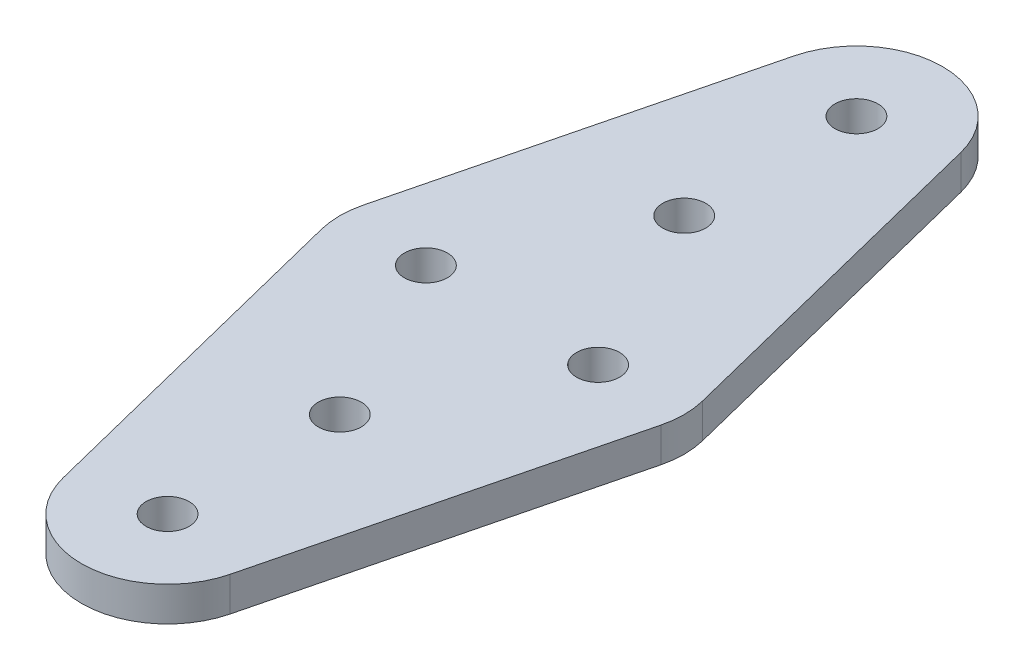
ISO-10303-21;
HEADER;
FILE_DESCRIPTION(('STEP AP214'),'2;1');
FILE_NAME('part.step','',(''),(''),'','','');
FILE_SCHEMA(('AUTOMOTIVE_DESIGN { 1 0 10303 214 1 1 1 1 }'));
ENDSEC;
DATA;
#1=APPLICATION_CONTEXT('core data for automotive mechanical design processes');
#2=APPLICATION_PROTOCOL_DEFINITION('international standard','automotive_design',2000,#1);
#3=PRODUCT_CONTEXT('',#1,'mechanical');
#4=PRODUCT('Part','Part','',(#3));
#5=PRODUCT_RELATED_PRODUCT_CATEGORY('part','',(#4));
#6=PRODUCT_DEFINITION_FORMATION('','',#4);
#7=PRODUCT_DEFINITION_CONTEXT('part definition',#1,'design');
#8=PRODUCT_DEFINITION('design','',#6,#7);
#9=PRODUCT_DEFINITION_SHAPE('','',#8);
#10=(LENGTH_UNIT() NAMED_UNIT(*) SI_UNIT(.MILLI.,.METRE.));
#11=(NAMED_UNIT(*) PLANE_ANGLE_UNIT() SI_UNIT($,.RADIAN.));
#12=(NAMED_UNIT(*) SI_UNIT($,.STERADIAN.) SOLID_ANGLE_UNIT());
#13=UNCERTAINTY_MEASURE_WITH_UNIT(LENGTH_MEASURE(1.E-05),#10,'distance_accuracy_value','');
#14=(GEOMETRIC_REPRESENTATION_CONTEXT(3) GLOBAL_UNCERTAINTY_ASSIGNED_CONTEXT((#13)) GLOBAL_UNIT_ASSIGNED_CONTEXT((#10,
#11,#12)) REPRESENTATION_CONTEXT('',''));
#15=CARTESIAN_POINT('',(0.,0.,0.));
#16=DIRECTION('',(0.,0.,1.));
#17=DIRECTION('',(1.,0.,0.));
#18=AXIS2_PLACEMENT_3D('',#15,#16,#17);
#19=CARTESIAN_POINT('',(-9.99999999999999,4.,0.));
#20=DIRECTION('',(0.,1.,0.));
#21=DIRECTION('',(0.,0.,1.));
#22=AXIS2_PLACEMENT_3D('',#19,#20,#21);
#23=PLANE('',#22);
#24=CARTESIAN_POINT('',(0.,4.,20.));
#25=DIRECTION('',(0.,1.,0.));
#26=DIRECTION('',(0.,0.,-1.));
#27=AXIS2_PLACEMENT_3D('',#24,#25,#26);
#28=CIRCLE('',#27,2.5);
#29=CARTESIAN_POINT('',(0.,4.,17.5));
#30=VERTEX_POINT('',#29);
#31=EDGE_CURVE('E204',#30,#30,#28,.T.);
#32=ORIENTED_EDGE('',*,*,#31,.F.);
#33=EDGE_LOOP('',(#32));
#34=FACE_BOUND('',#33,.T.);
#35=CARTESIAN_POINT('',(0.,4.,-20.));
#36=DIRECTION('',(0.,1.,0.));
#37=DIRECTION('',(0.,0.,1.));
#38=AXIS2_PLACEMENT_3D('',#35,#36,#37);
#39=CIRCLE('',#38,2.5);
#40=CARTESIAN_POINT('',(0.,4.,-17.5));
#41=VERTEX_POINT('',#40);
#42=EDGE_CURVE('E192',#41,#41,#39,.T.);
#43=ORIENTED_EDGE('',*,*,#42,.F.);
#44=EDGE_LOOP('',(#43));
#45=FACE_BOUND('',#44,.T.);
#46=CARTESIAN_POINT('',(10.,4.,0.));
#47=DIRECTION('',(0.,1.,0.));
#48=DIRECTION('',(0.,0.,1.));
#49=AXIS2_PLACEMENT_3D('',#46,#47,#48);
#50=CIRCLE('',#49,2.5);
#51=CARTESIAN_POINT('',(10.,4.,2.5));
#52=VERTEX_POINT('',#51);
#53=EDGE_CURVE('E138',#52,#52,#50,.T.);
#54=ORIENTED_EDGE('',*,*,#53,.F.);
#55=EDGE_LOOP('',(#54));
#56=FACE_BOUND('',#55,.T.);
#57=CARTESIAN_POINT('',(-9.99999999999999,4.,0.));
#58=DIRECTION('',(0.,1.,0.));
#59=DIRECTION('',(0.,0.,1.));
#60=AXIS2_PLACEMENT_3D('',#57,#58,#59);
#61=CIRCLE('',#60,10.);
#62=CARTESIAN_POINT('',(-19.7014250014533,4.,-2.42535625036333));
#63=VERTEX_POINT('',#62);
#64=CARTESIAN_POINT('',(-19.7014250014533,4.,2.42535625036333));
#65=VERTEX_POINT('',#64);
#66=EDGE_CURVE('E149',#63,#65,#61,.T.);
#67=ORIENTED_EDGE('',*,*,#66,.T.);
#68=DIRECTION('',(0.242535625036333,0.,0.970142500145332));
#69=VECTOR('',#68,1.);
#70=CARTESIAN_POINT('',(-9.70142500145332,4.,42.4253562503633));
#71=LINE('',#70,#69);
#72=CARTESIAN_POINT('',(-9.70142500145332,4.,42.4253562503633));
#73=VERTEX_POINT('',#72);
#74=EDGE_CURVE('E97',#65,#73,#71,.T.);
#75=ORIENTED_EDGE('',*,*,#74,.T.);
#76=CARTESIAN_POINT('',(0.,4.,40.));
#77=DIRECTION('',(0.,1.,0.));
#78=DIRECTION('',(0.,0.,-1.));
#79=AXIS2_PLACEMENT_3D('',#76,#77,#78);
#80=CIRCLE('',#79,10.);
#81=CARTESIAN_POINT('',(9.70142500145332,4.,42.4253562503633));
#82=VERTEX_POINT('',#81);
#83=EDGE_CURVE('E164',#73,#82,#80,.T.);
#84=ORIENTED_EDGE('',*,*,#83,.T.);
#85=DIRECTION('',(0.242535625036333,0.,-0.970142500145332));
#86=VECTOR('',#85,1.);
#87=CARTESIAN_POINT('',(9.70142500145332,4.,42.4253562503633));
#88=LINE('',#87,#86);
#89=CARTESIAN_POINT('',(19.7014250014533,4.,2.42535625036333));
#90=VERTEX_POINT('',#89);
#91=EDGE_CURVE('E177',#82,#90,#88,.T.);
#92=ORIENTED_EDGE('',*,*,#91,.T.);
#93=CARTESIAN_POINT('',(10.,4.,0.));
#94=DIRECTION('',(0.,1.,0.));
#95=DIRECTION('',(0.,0.,1.));
#96=AXIS2_PLACEMENT_3D('',#93,#94,#95);
#97=CIRCLE('',#96,10.);
#98=CARTESIAN_POINT('',(19.7014250014533,4.,-2.42535625036333));
#99=VERTEX_POINT('',#98);
#100=EDGE_CURVE('E116',#90,#99,#97,.T.);
#101=ORIENTED_EDGE('',*,*,#100,.T.);
#102=DIRECTION('',(-0.242535625036333,0.,-0.970142500145332));
#103=VECTOR('',#102,1.);
#104=CARTESIAN_POINT('',(9.70142500145332,4.,-42.4253562503633));
#105=LINE('',#104,#103);
#106=CARTESIAN_POINT('',(9.70142500145332,4.,-42.4253562503633));
#107=VERTEX_POINT('',#106);
#108=EDGE_CURVE('E110',#99,#107,#105,.T.);
#109=ORIENTED_EDGE('',*,*,#108,.T.);
#110=CARTESIAN_POINT('',(0.,4.,-40.));
#111=DIRECTION('',(0.,1.,0.));
#112=DIRECTION('',(0.,0.,1.));
#113=AXIS2_PLACEMENT_3D('',#110,#111,#112);
#114=CIRCLE('',#113,10.);
#115=CARTESIAN_POINT('',(-9.70142500145332,4.,-42.4253562503633));
#116=VERTEX_POINT('',#115);
#117=EDGE_CURVE('E114',#107,#116,#114,.T.);
#118=ORIENTED_EDGE('',*,*,#117,.T.);
#119=DIRECTION('',(-0.242535625036333,0.,0.970142500145332));
#120=VECTOR('',#119,1.);
#121=CARTESIAN_POINT('',(-9.70142500145332,4.,-42.4253562503633));
#122=LINE('',#121,#120);
#123=EDGE_CURVE('E54',#116,#63,#122,.T.);
#124=ORIENTED_EDGE('',*,*,#123,.T.);
#125=EDGE_LOOP('',(#67,#75,#84,#92,#101,#109,#118,#124));
#126=FACE_BOUND('',#125,.T.);
#127=CARTESIAN_POINT('',(-9.99999999999999,4.,0.));
#128=DIRECTION('',(0.,1.,0.));
#129=DIRECTION('',(0.,0.,-1.));
#130=AXIS2_PLACEMENT_3D('',#127,#128,#129);
#131=CIRCLE('',#130,2.5);
#132=CARTESIAN_POINT('',(-9.99999999999999,4.,-2.5));
#133=VERTEX_POINT('',#132);
#134=EDGE_CURVE('E186',#133,#133,#131,.T.);
#135=ORIENTED_EDGE('',*,*,#134,.F.);
#136=EDGE_LOOP('',(#135));
#137=FACE_BOUND('',#136,.T.);
#138=CARTESIAN_POINT('',(0.,4.,-40.));
#139=DIRECTION('',(0.,1.,0.));
#140=DIRECTION('',(0.,0.,1.));
#141=AXIS2_PLACEMENT_3D('',#138,#139,#140);
#142=CIRCLE('',#141,2.5);
#143=CARTESIAN_POINT('',(0.,4.,-37.5));
#144=VERTEX_POINT('',#143);
#145=EDGE_CURVE('E198',#144,#144,#142,.T.);
#146=ORIENTED_EDGE('',*,*,#145,.F.);
#147=EDGE_LOOP('',(#146));
#148=FACE_BOUND('',#147,.T.);
#149=CARTESIAN_POINT('',(0.,4.,40.));
#150=DIRECTION('',(0.,1.,0.));
#151=DIRECTION('',(0.,0.,-1.));
#152=AXIS2_PLACEMENT_3D('',#149,#150,#151);
#153=CIRCLE('',#152,2.5);
#154=CARTESIAN_POINT('',(0.,4.,37.5));
#155=VERTEX_POINT('',#154);
#156=EDGE_CURVE('E210',#155,#155,#153,.T.);
#157=ORIENTED_EDGE('',*,*,#156,.F.);
#158=EDGE_LOOP('',(#157));
#159=FACE_BOUND('',#158,.T.);
#160=ADVANCED_FACE('F37',(#34,#45,#56,#126,#137,#148,#159),#23,.T.);
#161=CARTESIAN_POINT('',(-9.99999999999999,0.,0.));
#162=DIRECTION('',(0.,1.,0.));
#163=DIRECTION('',(0.,0.,1.));
#164=AXIS2_PLACEMENT_3D('',#161,#162,#163);
#165=PLANE('',#164);
#166=CARTESIAN_POINT('',(-9.99999999999999,0.,0.));
#167=DIRECTION('',(0.,1.,0.));
#168=DIRECTION('',(0.,0.,1.));
#169=AXIS2_PLACEMENT_3D('',#166,#167,#168);
#170=CIRCLE('',#169,10.);
#171=CARTESIAN_POINT('',(-19.7014250014533,0.,-2.42535625036333));
#172=VERTEX_POINT('',#171);
#173=CARTESIAN_POINT('',(-19.7014250014533,0.,2.42535625036333));
#174=VERTEX_POINT('',#173);
#175=EDGE_CURVE('E134',#172,#174,#170,.T.);
#176=ORIENTED_EDGE('',*,*,#175,.F.);
#177=DIRECTION('',(-0.242535625036333,0.,0.970142500145332));
#178=VECTOR('',#177,1.);
#179=CARTESIAN_POINT('',(-9.70142500145332,0.,-42.4253562503633));
#180=LINE('',#179,#178);
#181=CARTESIAN_POINT('',(-9.70142500145332,0.,-42.4253562503633));
#182=VERTEX_POINT('',#181);
#183=EDGE_CURVE('E89',#182,#172,#180,.T.);
#184=ORIENTED_EDGE('',*,*,#183,.F.);
#185=CARTESIAN_POINT('',(0.,0.,-40.));
#186=DIRECTION('',(0.,1.,0.));
#187=DIRECTION('',(0.,0.,1.));
#188=AXIS2_PLACEMENT_3D('',#185,#186,#187);
#189=CIRCLE('',#188,10.);
#190=CARTESIAN_POINT('',(9.70142500145332,0.,-42.4253562503633));
#191=VERTEX_POINT('',#190);
#192=EDGE_CURVE('E83',#191,#182,#189,.T.);
#193=ORIENTED_EDGE('',*,*,#192,.F.);
#194=DIRECTION('',(-0.242535625036333,0.,-0.970142500145332));
#195=VECTOR('',#194,1.);
#196=CARTESIAN_POINT('',(9.70142500145332,0.,-42.4253562503633));
#197=LINE('',#196,#195);
#198=CARTESIAN_POINT('',(19.7014250014533,0.,-2.42535625036333));
#199=VERTEX_POINT('',#198);
#200=EDGE_CURVE('E124',#199,#191,#197,.T.);
#201=ORIENTED_EDGE('',*,*,#200,.F.);
#202=CARTESIAN_POINT('',(10.,0.,0.));
#203=DIRECTION('',(0.,1.,0.));
#204=DIRECTION('',(0.,0.,1.));
#205=AXIS2_PLACEMENT_3D('',#202,#203,#204);
#206=CIRCLE('',#205,10.);
#207=CARTESIAN_POINT('',(19.7014250014533,0.,2.42535625036333));
#208=VERTEX_POINT('',#207);
#209=EDGE_CURVE('E144',#208,#199,#206,.T.);
#210=ORIENTED_EDGE('',*,*,#209,.F.);
#211=DIRECTION('',(0.242535625036333,0.,-0.970142500145332));
#212=VECTOR('',#211,1.);
#213=CARTESIAN_POINT('',(9.70142500145332,0.,42.4253562503633));
#214=LINE('',#213,#212);
#215=CARTESIAN_POINT('',(9.70142500145332,0.,42.4253562503633));
#216=VERTEX_POINT('',#215);
#217=EDGE_CURVE('E142',#216,#208,#214,.T.);
#218=ORIENTED_EDGE('',*,*,#217,.F.);
#219=CARTESIAN_POINT('',(0.,0.,40.));
#220=DIRECTION('',(0.,1.,0.));
#221=DIRECTION('',(0.,0.,-1.));
#222=AXIS2_PLACEMENT_3D('',#219,#220,#221);
#223=CIRCLE('',#222,10.);
#224=CARTESIAN_POINT('',(-9.70142500145332,0.,42.4253562503633));
#225=VERTEX_POINT('',#224);
#226=EDGE_CURVE('E140',#225,#216,#223,.T.);
#227=ORIENTED_EDGE('',*,*,#226,.F.);
#228=DIRECTION('',(0.242535625036333,0.,0.970142500145332));
#229=VECTOR('',#228,1.);
#230=CARTESIAN_POINT('',(-9.70142500145332,0.,42.4253562503633));
#231=LINE('',#230,#229);
#232=EDGE_CURVE('E137',#174,#225,#231,.T.);
#233=ORIENTED_EDGE('',*,*,#232,.F.);
#234=EDGE_LOOP('',(#176,#184,#193,#201,#210,#218,#227,#233));
#235=FACE_BOUND('',#234,.T.);
#236=CARTESIAN_POINT('',(10.,0.,0.));
#237=DIRECTION('',(0.,1.,0.));
#238=DIRECTION('',(0.,0.,1.));
#239=AXIS2_PLACEMENT_3D('',#236,#237,#238);
#240=CIRCLE('',#239,2.5);
#241=CARTESIAN_POINT('',(10.,0.,2.5));
#242=VERTEX_POINT('',#241);
#243=EDGE_CURVE('E183',#242,#242,#240,.T.);
#244=ORIENTED_EDGE('',*,*,#243,.T.);
#245=EDGE_LOOP('',(#244));
#246=FACE_BOUND('',#245,.T.);
#247=CARTESIAN_POINT('',(-9.99999999999999,0.,0.));
#248=DIRECTION('',(0.,1.,0.));
#249=DIRECTION('',(0.,0.,-1.));
#250=AXIS2_PLACEMENT_3D('',#247,#248,#249);
#251=CIRCLE('',#250,2.5);
#252=CARTESIAN_POINT('',(-9.99999999999999,0.,-2.5));
#253=VERTEX_POINT('',#252);
#254=EDGE_CURVE('E189',#253,#253,#251,.T.);
#255=ORIENTED_EDGE('',*,*,#254,.T.);
#256=EDGE_LOOP('',(#255));
#257=FACE_BOUND('',#256,.T.);
#258=CARTESIAN_POINT('',(0.,0.,-20.));
#259=DIRECTION('',(0.,1.,0.));
#260=DIRECTION('',(0.,0.,1.));
#261=AXIS2_PLACEMENT_3D('',#258,#259,#260);
#262=CIRCLE('',#261,2.5);
#263=CARTESIAN_POINT('',(0.,0.,-17.5));
#264=VERTEX_POINT('',#263);
#265=EDGE_CURVE('E195',#264,#264,#262,.T.);
#266=ORIENTED_EDGE('',*,*,#265,.T.);
#267=EDGE_LOOP('',(#266));
#268=FACE_BOUND('',#267,.T.);
#269=CARTESIAN_POINT('',(0.,0.,-40.));
#270=DIRECTION('',(0.,1.,0.));
#271=DIRECTION('',(0.,0.,1.));
#272=AXIS2_PLACEMENT_3D('',#269,#270,#271);
#273=CIRCLE('',#272,2.5);
#274=CARTESIAN_POINT('',(0.,0.,-37.5));
#275=VERTEX_POINT('',#274);
#276=EDGE_CURVE('E201',#275,#275,#273,.T.);
#277=ORIENTED_EDGE('',*,*,#276,.T.);
#278=EDGE_LOOP('',(#277));
#279=FACE_BOUND('',#278,.T.);
#280=CARTESIAN_POINT('',(0.,0.,20.));
#281=DIRECTION('',(0.,1.,0.));
#282=DIRECTION('',(0.,0.,-1.));
#283=AXIS2_PLACEMENT_3D('',#280,#281,#282);
#284=CIRCLE('',#283,2.5);
#285=CARTESIAN_POINT('',(0.,0.,17.5));
#286=VERTEX_POINT('',#285);
#287=EDGE_CURVE('E207',#286,#286,#284,.T.);
#288=ORIENTED_EDGE('',*,*,#287,.T.);
#289=EDGE_LOOP('',(#288));
#290=FACE_BOUND('',#289,.T.);
#291=CARTESIAN_POINT('',(0.,0.,40.));
#292=DIRECTION('',(0.,1.,0.));
#293=DIRECTION('',(0.,0.,-1.));
#294=AXIS2_PLACEMENT_3D('',#291,#292,#293);
#295=CIRCLE('',#294,2.5);
#296=CARTESIAN_POINT('',(0.,0.,37.5));
#297=VERTEX_POINT('',#296);
#298=EDGE_CURVE('E213',#297,#297,#295,.T.);
#299=ORIENTED_EDGE('',*,*,#298,.T.);
#300=EDGE_LOOP('',(#299));
#301=FACE_BOUND('',#300,.T.);
#302=ADVANCED_FACE('F168',(#235,#246,#257,#268,#279,#290,#301),#165,.F.);
#303=CARTESIAN_POINT('',(-9.99999999999999,4.,0.));
#304=DIRECTION('',(0.,-1.,0.));
#305=DIRECTION('',(0.,0.,-1.));
#306=AXIS2_PLACEMENT_3D('',#303,#304,#305);
#307=CYLINDRICAL_SURFACE('',#306,10.);
#308=ORIENTED_EDGE('',*,*,#175,.T.);
#309=DIRECTION('',(0.,-1.,0.));
#310=VECTOR('',#309,1.);
#311=CARTESIAN_POINT('',(-19.7014250014533,4.,2.42535625036333));
#312=LINE('',#311,#310);
#313=EDGE_CURVE('E11',#65,#174,#312,.T.);
#314=ORIENTED_EDGE('',*,*,#313,.F.);
#315=ORIENTED_EDGE('',*,*,#66,.F.);
#316=DIRECTION('',(0.,-1.,0.));
#317=VECTOR('',#316,1.);
#318=CARTESIAN_POINT('',(-19.7014250014533,4.,-2.42535625036333));
#319=LINE('',#318,#317);
#320=EDGE_CURVE('E130',#63,#172,#319,.T.);
#321=ORIENTED_EDGE('',*,*,#320,.T.);
#322=EDGE_LOOP('',(#308,#314,#315,#321));
#323=FACE_BOUND('',#322,.T.);
#324=ADVANCED_FACE('F39',(#323),#307,.T.);
#325=CARTESIAN_POINT('',(-9.70142500145332,4.,42.4253562503633));
#326=DIRECTION('',(0.970142500145332,0.,-0.242535625036333));
#327=DIRECTION('',(-0.242535625036333,0.,-0.970142500145332));
#328=AXIS2_PLACEMENT_3D('',#325,#326,#327);
#329=PLANE('',#328);
#330=ORIENTED_EDGE('',*,*,#232,.T.);
#331=DIRECTION('',(0.,-1.,0.));
#332=VECTOR('',#331,1.);
#333=CARTESIAN_POINT('',(-9.70142500145332,4.,42.4253562503633));
#334=LINE('',#333,#332);
#335=EDGE_CURVE('E46',#73,#225,#334,.T.);
#336=ORIENTED_EDGE('',*,*,#335,.F.);
#337=ORIENTED_EDGE('',*,*,#74,.F.);
#338=ORIENTED_EDGE('',*,*,#313,.T.);
#339=EDGE_LOOP('',(#330,#336,#337,#338));
#340=FACE_BOUND('',#339,.T.);
#341=ADVANCED_FACE('F247',(#340),#329,.F.);
#342=CARTESIAN_POINT('',(0.,4.,40.));
#343=DIRECTION('',(0.,-1.,0.));
#344=DIRECTION('',(0.,0.,-1.));
#345=AXIS2_PLACEMENT_3D('',#342,#343,#344);
#346=CYLINDRICAL_SURFACE('',#345,10.);
#347=ORIENTED_EDGE('',*,*,#226,.T.);
#348=DIRECTION('',(0.,-1.,0.));
#349=VECTOR('',#348,1.);
#350=CARTESIAN_POINT('',(9.70142500145332,4.,42.4253562503633));
#351=LINE('',#350,#349);
#352=EDGE_CURVE('E156',#82,#216,#351,.T.);
#353=ORIENTED_EDGE('',*,*,#352,.F.);
#354=ORIENTED_EDGE('',*,*,#83,.F.);
#355=ORIENTED_EDGE('',*,*,#335,.T.);
#356=EDGE_LOOP('',(#347,#353,#354,#355));
#357=FACE_BOUND('',#356,.T.);
#358=ADVANCED_FACE('F162',(#357),#346,.T.);
#359=CARTESIAN_POINT('',(9.70142500145332,4.,42.4253562503633));
#360=DIRECTION('',(-0.970142500145332,0.,-0.242535625036333));
#361=DIRECTION('',(-0.242535625036333,0.,0.970142500145332));
#362=AXIS2_PLACEMENT_3D('',#359,#360,#361);
#363=PLANE('',#362);
#364=ORIENTED_EDGE('',*,*,#217,.T.);
#365=DIRECTION('',(0.,-1.,0.));
#366=VECTOR('',#365,1.);
#367=CARTESIAN_POINT('',(19.7014250014533,4.,2.42535625036333));
#368=LINE('',#367,#366);
#369=EDGE_CURVE('E153',#90,#208,#368,.T.);
#370=ORIENTED_EDGE('',*,*,#369,.F.);
#371=ORIENTED_EDGE('',*,*,#91,.F.);
#372=ORIENTED_EDGE('',*,*,#352,.T.);
#373=EDGE_LOOP('',(#364,#370,#371,#372));
#374=FACE_BOUND('',#373,.T.);
#375=ADVANCED_FACE('F173',(#374),#363,.F.);
#376=CARTESIAN_POINT('',(10.,4.,0.));
#377=DIRECTION('',(0.,-1.,0.));
#378=DIRECTION('',(0.,0.,-1.));
#379=AXIS2_PLACEMENT_3D('',#376,#377,#378);
#380=CYLINDRICAL_SURFACE('',#379,10.);
#381=ORIENTED_EDGE('',*,*,#209,.T.);
#382=DIRECTION('',(0.,-1.,0.));
#383=VECTOR('',#382,1.);
#384=CARTESIAN_POINT('',(19.7014250014533,4.,-2.42535625036333));
#385=LINE('',#384,#383);
#386=EDGE_CURVE('E125',#99,#199,#385,.T.);
#387=ORIENTED_EDGE('',*,*,#386,.F.);
#388=ORIENTED_EDGE('',*,*,#100,.F.);
#389=ORIENTED_EDGE('',*,*,#369,.T.);
#390=EDGE_LOOP('',(#381,#387,#388,#389));
#391=FACE_BOUND('',#390,.T.);
#392=ADVANCED_FACE('F176',(#391),#380,.T.);
#393=CARTESIAN_POINT('',(9.70142500145332,4.,-42.4253562503633));
#394=DIRECTION('',(-0.970142500145332,0.,0.242535625036333));
#395=DIRECTION('',(0.242535625036333,0.,0.970142500145332));
#396=AXIS2_PLACEMENT_3D('',#393,#394,#395);
#397=PLANE('',#396);
#398=ORIENTED_EDGE('',*,*,#200,.T.);
#399=DIRECTION('',(0.,-1.,0.));
#400=VECTOR('',#399,1.);
#401=CARTESIAN_POINT('',(9.70142500145332,4.,-42.4253562503633));
#402=LINE('',#401,#400);
#403=EDGE_CURVE('E121',#107,#191,#402,.T.);
#404=ORIENTED_EDGE('',*,*,#403,.F.);
#405=ORIENTED_EDGE('',*,*,#108,.F.);
#406=ORIENTED_EDGE('',*,*,#386,.T.);
#407=EDGE_LOOP('',(#398,#404,#405,#406));
#408=FACE_BOUND('',#407,.T.);
#409=ADVANCED_FACE('F122',(#408),#397,.F.);
#410=CARTESIAN_POINT('',(0.,4.,-40.));
#411=DIRECTION('',(0.,-1.,0.));
#412=DIRECTION('',(0.,0.,-1.));
#413=AXIS2_PLACEMENT_3D('',#410,#411,#412);
#414=CYLINDRICAL_SURFACE('',#413,10.);
#415=ORIENTED_EDGE('',*,*,#192,.T.);
#416=DIRECTION('',(0.,-1.,0.));
#417=VECTOR('',#416,1.);
#418=CARTESIAN_POINT('',(-9.70142500145332,4.,-42.4253562503633));
#419=LINE('',#418,#417);
#420=EDGE_CURVE('E126',#116,#182,#419,.T.);
#421=ORIENTED_EDGE('',*,*,#420,.F.);
#422=ORIENTED_EDGE('',*,*,#117,.F.);
#423=ORIENTED_EDGE('',*,*,#403,.T.);
#424=EDGE_LOOP('',(#415,#421,#422,#423));
#425=FACE_BOUND('',#424,.T.);
#426=ADVANCED_FACE('F128',(#425),#414,.T.);
#427=CARTESIAN_POINT('',(-9.70142500145332,4.,-42.4253562503633));
#428=DIRECTION('',(0.970142500145332,0.,0.242535625036333));
#429=DIRECTION('',(0.242535625036333,0.,-0.970142500145332));
#430=AXIS2_PLACEMENT_3D('',#427,#428,#429);
#431=PLANE('',#430);
#432=ORIENTED_EDGE('',*,*,#183,.T.);
#433=ORIENTED_EDGE('',*,*,#320,.F.);
#434=ORIENTED_EDGE('',*,*,#123,.F.);
#435=ORIENTED_EDGE('',*,*,#420,.T.);
#436=EDGE_LOOP('',(#432,#433,#434,#435));
#437=FACE_BOUND('',#436,.T.);
#438=ADVANCED_FACE('F235',(#437),#431,.F.);
#439=CARTESIAN_POINT('',(10.,4.,0.));
#440=DIRECTION('',(0.,-1.,0.));
#441=DIRECTION('',(0.,0.,-1.));
#442=AXIS2_PLACEMENT_3D('',#439,#440,#441);
#443=CYLINDRICAL_SURFACE('',#442,2.5);
#444=ORIENTED_EDGE('',*,*,#53,.T.);
#445=EDGE_LOOP('',(#444));
#446=FACE_BOUND('',#445,.T.);
#447=ORIENTED_EDGE('',*,*,#243,.F.);
#448=EDGE_LOOP('',(#447));
#449=FACE_BOUND('',#448,.T.);
#450=ADVANCED_FACE('F232',(#446,#449),#443,.F.);
#451=CARTESIAN_POINT('',(-9.99999999999999,4.,0.));
#452=DIRECTION('',(0.,-1.,0.));
#453=DIRECTION('',(0.,0.,-1.));
#454=AXIS2_PLACEMENT_3D('',#451,#452,#453);
#455=CYLINDRICAL_SURFACE('',#454,2.5);
#456=ORIENTED_EDGE('',*,*,#134,.T.);
#457=EDGE_LOOP('',(#456));
#458=FACE_BOUND('',#457,.T.);
#459=ORIENTED_EDGE('',*,*,#254,.F.);
#460=EDGE_LOOP('',(#459));
#461=FACE_BOUND('',#460,.T.);
#462=ADVANCED_FACE('F311',(#458,#461),#455,.F.);
#463=CARTESIAN_POINT('',(0.,4.,-20.));
#464=DIRECTION('',(0.,-1.,0.));
#465=DIRECTION('',(0.,0.,-1.));
#466=AXIS2_PLACEMENT_3D('',#463,#464,#465);
#467=CYLINDRICAL_SURFACE('',#466,2.5);
#468=ORIENTED_EDGE('',*,*,#42,.T.);
#469=EDGE_LOOP('',(#468));
#470=FACE_BOUND('',#469,.T.);
#471=ORIENTED_EDGE('',*,*,#265,.F.);
#472=EDGE_LOOP('',(#471));
#473=FACE_BOUND('',#472,.T.);
#474=ADVANCED_FACE('F319',(#470,#473),#467,.F.);
#475=CARTESIAN_POINT('',(0.,4.,-40.));
#476=DIRECTION('',(0.,-1.,0.));
#477=DIRECTION('',(0.,0.,-1.));
#478=AXIS2_PLACEMENT_3D('',#475,#476,#477);
#479=CYLINDRICAL_SURFACE('',#478,2.5);
#480=ORIENTED_EDGE('',*,*,#145,.T.);
#481=EDGE_LOOP('',(#480));
#482=FACE_BOUND('',#481,.T.);
#483=ORIENTED_EDGE('',*,*,#276,.F.);
#484=EDGE_LOOP('',(#483));
#485=FACE_BOUND('',#484,.T.);
#486=ADVANCED_FACE('F327',(#482,#485),#479,.F.);
#487=CARTESIAN_POINT('',(0.,4.,20.));
#488=DIRECTION('',(0.,-1.,0.));
#489=DIRECTION('',(0.,0.,-1.));
#490=AXIS2_PLACEMENT_3D('',#487,#488,#489);
#491=CYLINDRICAL_SURFACE('',#490,2.5);
#492=ORIENTED_EDGE('',*,*,#31,.T.);
#493=EDGE_LOOP('',(#492));
#494=FACE_BOUND('',#493,.T.);
#495=ORIENTED_EDGE('',*,*,#287,.F.);
#496=EDGE_LOOP('',(#495));
#497=FACE_BOUND('',#496,.T.);
#498=ADVANCED_FACE('F336',(#494,#497),#491,.F.);
#499=CARTESIAN_POINT('',(0.,4.,40.));
#500=DIRECTION('',(0.,-1.,0.));
#501=DIRECTION('',(0.,0.,-1.));
#502=AXIS2_PLACEMENT_3D('',#499,#500,#501);
#503=CYLINDRICAL_SURFACE('',#502,2.5);
#504=ORIENTED_EDGE('',*,*,#156,.T.);
#505=EDGE_LOOP('',(#504));
#506=FACE_BOUND('',#505,.T.);
#507=ORIENTED_EDGE('',*,*,#298,.F.);
#508=EDGE_LOOP('',(#507));
#509=FACE_BOUND('',#508,.T.);
#510=ADVANCED_FACE('F219',(#506,#509),#503,.F.);
#511=CLOSED_SHELL('',(#160,#302,#324,#341,#358,#375,#392,#409,#426,#438,#450,#462,#474,#486,
#498,#510));
#512=MANIFOLD_SOLID_BREP('B2',#511);
#513=ADVANCED_BREP_SHAPE_REPRESENTATION('',(#18,#512),#14);
#514=SHAPE_DEFINITION_REPRESENTATION(#9,#513);
ENDSEC;
END-ISO-10303-21;
